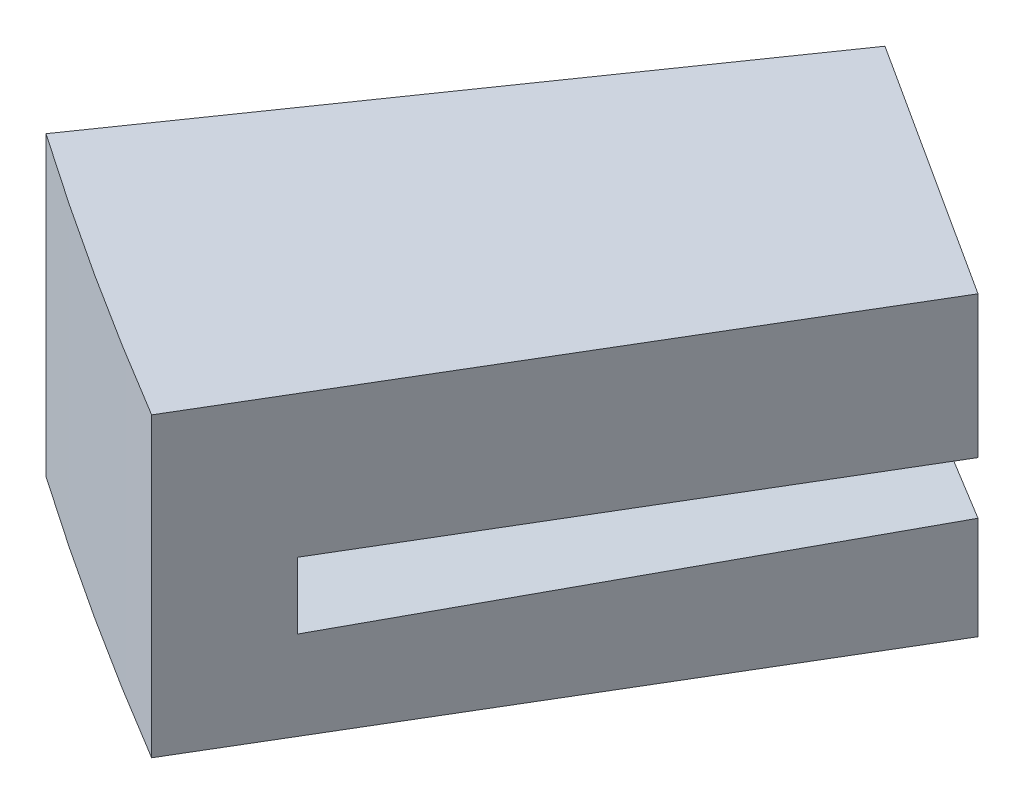
ISO-10303-21;
HEADER;
FILE_DESCRIPTION(('STEP AP214'),'2;1');
FILE_NAME('part.step','',(''),(''),'','','');
FILE_SCHEMA(('AUTOMOTIVE_DESIGN { 1 0 10303 214 1 1 1 1 }'));
ENDSEC;
DATA;
#1=APPLICATION_CONTEXT('core data for automotive mechanical design processes');
#2=APPLICATION_PROTOCOL_DEFINITION('international standard','automotive_design',2000,#1);
#3=PRODUCT_CONTEXT('',#1,'mechanical');
#4=PRODUCT('Part','Part','',(#3));
#5=PRODUCT_RELATED_PRODUCT_CATEGORY('part','',(#4));
#6=PRODUCT_DEFINITION_FORMATION('','',#4);
#7=PRODUCT_DEFINITION_CONTEXT('part definition',#1,'design');
#8=PRODUCT_DEFINITION('design','',#6,#7);
#9=PRODUCT_DEFINITION_SHAPE('','',#8);
#10=(LENGTH_UNIT() NAMED_UNIT(*) SI_UNIT(.MILLI.,.METRE.));
#11=(NAMED_UNIT(*) PLANE_ANGLE_UNIT() SI_UNIT($,.RADIAN.));
#12=(NAMED_UNIT(*) SI_UNIT($,.STERADIAN.) SOLID_ANGLE_UNIT());
#13=UNCERTAINTY_MEASURE_WITH_UNIT(LENGTH_MEASURE(1.E-05),#10,'distance_accuracy_value','');
#14=(GEOMETRIC_REPRESENTATION_CONTEXT(3) GLOBAL_UNCERTAINTY_ASSIGNED_CONTEXT((#13)) GLOBAL_UNIT_ASSIGNED_CONTEXT((#10,
#11,#12)) REPRESENTATION_CONTEXT('',''));
#15=CARTESIAN_POINT('',(0.,0.,0.));
#16=DIRECTION('',(0.,0.,1.));
#17=DIRECTION('',(1.,0.,0.));
#18=AXIS2_PLACEMENT_3D('',#15,#16,#17);
#19=CARTESIAN_POINT('',(0.,0.,0.));
#20=DIRECTION('',(0.,-1.,0.));
#21=DIRECTION('',(0.,0.,-1.));
#22=AXIS2_PLACEMENT_3D('',#19,#20,#21);
#23=PLANE('',#22);
#24=CARTESIAN_POINT('',(0.,0.,0.));
#25=DIRECTION('',(0.,-1.,0.));
#26=DIRECTION('',(0.,0.,-1.));
#27=AXIS2_PLACEMENT_3D('',#24,#25,#26);
#28=CIRCLE('',#27,318.439999898);
#29=CARTESIAN_POINT('',(-162.866634619958,0.,273.639348162152));
#30=VERTEX_POINT('',#29);
#31=CARTESIAN_POINT('',(-181.558015689106,0.,261.611774341433));
#32=VERTEX_POINT('',#31);
#33=EDGE_CURVE('E121',#30,#32,#28,.T.);
#34=ORIENTED_EDGE('',*,*,#33,.F.);
#35=DIRECTION('',(-0.840939238075142,0.,-0.541129557375681));
#36=VECTOR('',#35,1.);
#37=CARTESIAN_POINT('',(-172.212325154532,0.,267.625561251792));
#38=LINE('',#37,#36);
#39=EDGE_CURVE('E120',#30,#32,#38,.T.);
#40=ORIENTED_EDGE('',*,*,#39,.T.);
#41=EDGE_LOOP('',(#34,#40));
#42=FACE_BOUND('',#41,.T.);
#43=ADVANCED_FACE('F41',(#42),#23,.F.);
#44=CARTESIAN_POINT('',(-7.52478073643214E-13,4.7625,-5.22218184728641E-13));
#45=DIRECTION('',(0.821541811409466,0.,0.570148272036365));
#46=DIRECTION('',(0.570148272036365,0.,-0.821541811409467));
#47=AXIS2_PLACEMENT_3D('',#44,#45,#46);
#48=PLANE('',#47);
#49=DIRECTION('',(0.,-1.,0.));
#50=VECTOR('',#49,1.);
#51=CARTESIAN_POINT('',(-201.832488242719,4.7625,290.825801155153));
#52=LINE('',#51,#50);
#53=CARTESIAN_POINT('',(-201.832488242719,4.7625,290.825801155153));
#54=VERTEX_POINT('',#53);
#55=CARTESIAN_POINT('',(-201.832488242718,0.,290.825801155154));
#56=VERTEX_POINT('',#55);
#57=EDGE_CURVE('E128',#54,#56,#52,.T.);
#58=ORIENTED_EDGE('',*,*,#57,.T.);
#59=DIRECTION('',(-0.569922963928908,-0.0281103719182743,0.821217158964122));
#60=VECTOR('',#59,1.);
#61=CARTESIAN_POINT('',(-0.159486621275935,9.94713924557816,0.229808515021203));
#62=LINE('',#61,#60);
#63=CARTESIAN_POINT('',(-181.558015689105,1.,261.611774341433));
#64=VERTEX_POINT('',#63);
#65=EDGE_CURVE('E113',#64,#56,#62,.T.);
#66=ORIENTED_EDGE('',*,*,#65,.F.);
#67=DIRECTION('',(0.,1.,0.));
#68=VECTOR('',#67,1.);
#69=CARTESIAN_POINT('',(-181.558015689105,0.,261.611774341433));
#70=LINE('',#69,#68);
#71=EDGE_CURVE('E125',#32,#64,#70,.T.);
#72=ORIENTED_EDGE('',*,*,#71,.F.);
#73=DIRECTION('',(0.,1.,0.));
#74=VECTOR('',#73,1.);
#75=CARTESIAN_POINT('',(-181.558015689106,-6.35,261.611774341433));
#76=LINE('',#75,#74);
#77=CARTESIAN_POINT('',(-181.558015689106,-6.35,261.611774341433));
#78=VERTEX_POINT('',#77);
#79=EDGE_CURVE('E156',#78,#32,#76,.T.);
#80=ORIENTED_EDGE('',*,*,#79,.F.);
#81=DIRECTION('',(0.570148272036365,0.,-0.821541811409466));
#82=VECTOR('',#81,1.);
#83=CARTESIAN_POINT('',(-7.52478073643214E-13,-6.35,-5.22218184728641E-13));
#84=LINE('',#83,#82);
#85=CARTESIAN_POINT('',(-206.177018075636,-6.35,297.085949758093));
#86=VERTEX_POINT('',#85);
#87=EDGE_CURVE('E143',#86,#78,#84,.T.);
#88=ORIENTED_EDGE('',*,*,#87,.F.);
#89=DIRECTION('',(0.,-1.,0.));
#90=VECTOR('',#89,1.);
#91=CARTESIAN_POINT('',(-206.177018075636,4.7625,297.085949758093));
#92=LINE('',#91,#90);
#93=CARTESIAN_POINT('',(-206.177018075636,14.9225,297.085949758093));
#94=VERTEX_POINT('',#93);
#95=EDGE_CURVE('E11',#94,#86,#92,.T.);
#96=ORIENTED_EDGE('',*,*,#95,.F.);
#97=DIRECTION('',(-0.570148272036365,0.,0.821541811409467));
#98=VECTOR('',#97,1.);
#99=CARTESIAN_POINT('',(-206.177018075636,14.9225,297.085949758093));
#100=LINE('',#99,#98);
#101=CARTESIAN_POINT('',(-181.558015689106,14.9225,261.611774341433));
#102=VERTEX_POINT('',#101);
#103=EDGE_CURVE('E166',#102,#94,#100,.T.);
#104=ORIENTED_EDGE('',*,*,#103,.F.);
#105=DIRECTION('',(0.,-1.,0.));
#106=VECTOR('',#105,1.);
#107=CARTESIAN_POINT('',(-181.558015689106,14.9225,261.611774341433));
#108=LINE('',#107,#106);
#109=CARTESIAN_POINT('',(-181.558015689106,4.7625,261.611774341433));
#110=VERTEX_POINT('',#109);
#111=EDGE_CURVE('E169',#102,#110,#108,.T.);
#112=ORIENTED_EDGE('',*,*,#111,.T.);
#113=DIRECTION('',(-0.570148272036365,0.,0.821541811409467));
#114=VECTOR('',#113,1.);
#115=CARTESIAN_POINT('',(-206.177018075636,4.7625,297.085949758093));
#116=LINE('',#115,#114);
#117=EDGE_CURVE('E162',#110,#54,#116,.T.);
#118=ORIENTED_EDGE('',*,*,#117,.T.);
#119=EDGE_LOOP('',(#58,#66,#72,#80,#88,#96,#104,#112,#118));
#120=FACE_BOUND('',#119,.T.);
#121=ADVANCED_FACE('F43',(#120),#48,.F.);
#122=CARTESIAN_POINT('',(0.,4.7625,0.));
#123=DIRECTION('',(0.,-1.,0.));
#124=DIRECTION('',(0.,0.,-1.));
#125=AXIS2_PLACEMENT_3D('',#122,#123,#124);
#126=CYLINDRICAL_SURFACE('',#125,361.619999898);
#127=ORIENTED_EDGE('',*,*,#95,.T.);
#128=CARTESIAN_POINT('',(0.,-6.35,0.));
#129=DIRECTION('',(0.,-1.,0.));
#130=DIRECTION('',(0.,0.,-1.));
#131=AXIS2_PLACEMENT_3D('',#128,#129,#130);
#132=CIRCLE('',#131,361.619999898);
#133=CARTESIAN_POINT('',(-184.951112967974,-6.35,310.744445064006));
#134=VERTEX_POINT('',#133);
#135=EDGE_CURVE('E140',#134,#86,#132,.T.);
#136=ORIENTED_EDGE('',*,*,#135,.F.);
#137=DIRECTION('',(0.,-1.,0.));
#138=VECTOR('',#137,1.);
#139=CARTESIAN_POINT('',(-184.951112967974,4.7625,310.744445064006));
#140=LINE('',#139,#138);
#141=CARTESIAN_POINT('',(-184.951112967974,14.9225,310.744445064006));
#142=VERTEX_POINT('',#141);
#143=EDGE_CURVE('E49',#142,#134,#140,.T.);
#144=ORIENTED_EDGE('',*,*,#143,.F.);
#145=CARTESIAN_POINT('',(0.,14.9225,0.));
#146=DIRECTION('',(0.,1.,0.));
#147=DIRECTION('',(0.,0.,1.));
#148=AXIS2_PLACEMENT_3D('',#145,#146,#147);
#149=CIRCLE('',#148,361.619999898);
#150=EDGE_CURVE('E158',#94,#142,#149,.T.);
#151=ORIENTED_EDGE('',*,*,#150,.F.);
#152=EDGE_LOOP('',(#127,#136,#144,#151));
#153=FACE_BOUND('',#152,.T.);
#154=ADVANCED_FACE('F196',(#153),#126,.T.);
#155=CARTESIAN_POINT('',(5.48566151552732E-13,4.7625,3.26499546099171E-13));
#156=DIRECTION('',(0.859312109815982,0.,0.511451559703952));
#157=DIRECTION('',(0.511451559703952,0.,-0.859312109815983));
#158=AXIS2_PLACEMENT_3D('',#155,#156,#157);
#159=PLANE('',#158);
#160=ORIENTED_EDGE('',*,*,#143,.T.);
#161=DIRECTION('',(-0.511451559703952,0.,0.859312109815982));
#162=VECTOR('',#161,1.);
#163=CARTESIAN_POINT('',(5.48566151552732E-13,-6.35,3.26499546099171E-13));
#164=LINE('',#163,#162);
#165=CARTESIAN_POINT('',(-162.866634619958,-6.35,273.639348162152));
#166=VERTEX_POINT('',#165);
#167=EDGE_CURVE('E148',#166,#134,#164,.T.);
#168=ORIENTED_EDGE('',*,*,#167,.F.);
#169=DIRECTION('',(0.,1.,0.));
#170=VECTOR('',#169,1.);
#171=CARTESIAN_POINT('',(-162.866634619958,-6.35,273.639348162152));
#172=LINE('',#171,#170);
#173=EDGE_CURVE('E151',#166,#30,#172,.T.);
#174=ORIENTED_EDGE('',*,*,#173,.T.);
#175=DIRECTION('',(0.,1.,0.));
#176=VECTOR('',#175,1.);
#177=CARTESIAN_POINT('',(-162.866634619958,0.,273.639348162152));
#178=LINE('',#177,#176);
#179=CARTESIAN_POINT('',(-162.866634619958,1.,273.639348162152));
#180=VERTEX_POINT('',#179);
#181=EDGE_CURVE('E135',#30,#180,#178,.T.);
#182=ORIENTED_EDGE('',*,*,#181,.T.);
#183=DIRECTION('',(-0.511249447045499,-0.0281103719182743,0.858972531508597));
#184=VECTOR('',#183,1.);
#185=CARTESIAN_POINT('',(-0.143067488238024,9.94713924557816,0.240373937338321));
#186=LINE('',#185,#184);
#187=CARTESIAN_POINT('',(-181.053852083031,0.,304.196486787208));
#188=VERTEX_POINT('',#187);
#189=EDGE_CURVE('E116',#180,#188,#186,.T.);
#190=ORIENTED_EDGE('',*,*,#189,.T.);
#191=DIRECTION('',(0.,-1.,0.));
#192=VECTOR('',#191,1.);
#193=CARTESIAN_POINT('',(-181.05385208303,4.7625,304.196486787208));
#194=LINE('',#193,#192);
#195=CARTESIAN_POINT('',(-181.05385208303,4.7625,304.196486787208));
#196=VERTEX_POINT('',#195);
#197=EDGE_CURVE('E183',#196,#188,#194,.T.);
#198=ORIENTED_EDGE('',*,*,#197,.F.);
#199=DIRECTION('',(0.51145155970395,0.,-0.859312109815984));
#200=VECTOR('',#199,1.);
#201=CARTESIAN_POINT('',(-184.951112967974,4.7625,310.744445064006));
#202=LINE('',#201,#200);
#203=CARTESIAN_POINT('',(-162.866634619958,4.7625,273.639348162152));
#204=VERTEX_POINT('',#203);
#205=EDGE_CURVE('E56',#196,#204,#202,.T.);
#206=ORIENTED_EDGE('',*,*,#205,.T.);
#207=DIRECTION('',(0.,-1.,0.));
#208=VECTOR('',#207,1.);
#209=CARTESIAN_POINT('',(-162.866634619958,14.9225,273.639348162152));
#210=LINE('',#209,#208);
#211=CARTESIAN_POINT('',(-162.866634619958,14.9225,273.639348162152));
#212=VERTEX_POINT('',#211);
#213=EDGE_CURVE('E176',#212,#204,#210,.T.);
#214=ORIENTED_EDGE('',*,*,#213,.F.);
#215=DIRECTION('',(0.51145155970395,0.,-0.859312109815984));
#216=VECTOR('',#215,1.);
#217=CARTESIAN_POINT('',(-184.951112967974,14.9225,310.744445064006));
#218=LINE('',#217,#216);
#219=EDGE_CURVE('E161',#142,#212,#218,.T.);
#220=ORIENTED_EDGE('',*,*,#219,.F.);
#221=EDGE_LOOP('',(#160,#168,#174,#182,#190,#198,#206,#214,#220));
#222=FACE_BOUND('',#221,.T.);
#223=ADVANCED_FACE('F188',(#222),#159,.T.);
#224=CARTESIAN_POINT('',(0.,4.7625,0.));
#225=DIRECTION('',(0.,-1.,0.));
#226=DIRECTION('',(0.,0.,-1.));
#227=AXIS2_PLACEMENT_3D('',#224,#225,#226);
#228=CYLINDRICAL_SURFACE('',#227,353.999999898);
#229=CARTESIAN_POINT('',(0.,0.,0.));
#230=DIRECTION('',(0.,1.,0.));
#231=DIRECTION('',(0.,0.,1.));
#232=AXIS2_PLACEMENT_3D('',#229,#230,#231);
#233=CIRCLE('',#232,353.999999898);
#234=EDGE_CURVE('E179',#56,#188,#233,.T.);
#235=ORIENTED_EDGE('',*,*,#234,.F.);
#236=ORIENTED_EDGE('',*,*,#57,.F.);
#237=CARTESIAN_POINT('',(0.,4.7625,0.));
#238=DIRECTION('',(0.,1.,0.));
#239=DIRECTION('',(0.,0.,1.));
#240=AXIS2_PLACEMENT_3D('',#237,#238,#239);
#241=CIRCLE('',#240,353.999999898);
#242=EDGE_CURVE('E61',#54,#196,#241,.T.);
#243=ORIENTED_EDGE('',*,*,#242,.T.);
#244=ORIENTED_EDGE('',*,*,#197,.T.);
#245=EDGE_LOOP('',(#235,#236,#243,#244));
#246=FACE_BOUND('',#245,.T.);
#247=ADVANCED_FACE('F221',(#246),#228,.F.);
#248=CARTESIAN_POINT('',(0.,4.7625,0.));
#249=DIRECTION('',(0.,1.,0.));
#250=DIRECTION('',(0.,0.,1.));
#251=AXIS2_PLACEMENT_3D('',#248,#249,#250);
#252=PLANE('',#251);
#253=ORIENTED_EDGE('',*,*,#242,.F.);
#254=ORIENTED_EDGE('',*,*,#117,.F.);
#255=DIRECTION('',(-0.84093923807514,0.,-0.541129557375683));
#256=VECTOR('',#255,1.);
#257=CARTESIAN_POINT('',(-181.558015689106,4.7625,261.611774341433));
#258=LINE('',#257,#256);
#259=EDGE_CURVE('E171',#204,#110,#258,.T.);
#260=ORIENTED_EDGE('',*,*,#259,.F.);
#261=ORIENTED_EDGE('',*,*,#205,.F.);
#262=EDGE_LOOP('',(#253,#254,#260,#261));
#263=FACE_BOUND('',#262,.T.);
#264=ADVANCED_FACE('F218',(#263),#252,.F.);
#265=CARTESIAN_POINT('',(-181.558015689106,14.9225,261.611774341433));
#266=DIRECTION('',(-0.541129557375683,0.,0.840939238075141));
#267=DIRECTION('',(0.840939238075141,0.,0.541129557375683));
#268=AXIS2_PLACEMENT_3D('',#265,#266,#267);
#269=PLANE('',#268);
#270=ORIENTED_EDGE('',*,*,#259,.T.);
#271=ORIENTED_EDGE('',*,*,#111,.F.);
#272=DIRECTION('',(-0.84093923807514,0.,-0.541129557375683));
#273=VECTOR('',#272,1.);
#274=CARTESIAN_POINT('',(-181.558015689106,14.9225,261.611774341433));
#275=LINE('',#274,#273);
#276=EDGE_CURVE('E164',#212,#102,#275,.T.);
#277=ORIENTED_EDGE('',*,*,#276,.F.);
#278=ORIENTED_EDGE('',*,*,#213,.T.);
#279=EDGE_LOOP('',(#270,#271,#277,#278));
#280=FACE_BOUND('',#279,.T.);
#281=ADVANCED_FACE('F216',(#280),#269,.F.);
#282=CARTESIAN_POINT('',(0.,14.9225,0.));
#283=DIRECTION('',(0.,1.,0.));
#284=DIRECTION('',(0.,0.,1.));
#285=AXIS2_PLACEMENT_3D('',#282,#283,#284);
#286=PLANE('',#285);
#287=ORIENTED_EDGE('',*,*,#150,.T.);
#288=ORIENTED_EDGE('',*,*,#219,.T.);
#289=ORIENTED_EDGE('',*,*,#276,.T.);
#290=ORIENTED_EDGE('',*,*,#103,.T.);
#291=EDGE_LOOP('',(#287,#288,#289,#290));
#292=FACE_BOUND('',#291,.T.);
#293=ADVANCED_FACE('F213',(#292),#286,.T.);
#294=CARTESIAN_POINT('',(-172.212325154532,-6.35,267.625561251792));
#295=DIRECTION('',(0.541129557375681,0.,-0.840939238075142));
#296=DIRECTION('',(-0.840939238075142,0.,-0.541129557375681));
#297=AXIS2_PLACEMENT_3D('',#294,#295,#296);
#298=PLANE('',#297);
#299=ORIENTED_EDGE('',*,*,#39,.F.);
#300=ORIENTED_EDGE('',*,*,#173,.F.);
#301=DIRECTION('',(-0.840939238075142,0.,-0.541129557375681));
#302=VECTOR('',#301,1.);
#303=CARTESIAN_POINT('',(-172.212325154532,-6.35,267.625561251792));
#304=LINE('',#303,#302);
#305=EDGE_CURVE('E145',#166,#78,#304,.T.);
#306=ORIENTED_EDGE('',*,*,#305,.T.);
#307=ORIENTED_EDGE('',*,*,#79,.T.);
#308=EDGE_LOOP('',(#299,#300,#306,#307));
#309=FACE_BOUND('',#308,.T.);
#310=ADVANCED_FACE('F201',(#309),#298,.T.);
#311=CARTESIAN_POINT('',(0.,-6.35,0.));
#312=DIRECTION('',(0.,-1.,0.));
#313=DIRECTION('',(0.,0.,-1.));
#314=AXIS2_PLACEMENT_3D('',#311,#312,#313);
#315=PLANE('',#314);
#316=ORIENTED_EDGE('',*,*,#135,.T.);
#317=ORIENTED_EDGE('',*,*,#87,.T.);
#318=ORIENTED_EDGE('',*,*,#305,.F.);
#319=ORIENTED_EDGE('',*,*,#167,.T.);
#320=EDGE_LOOP('',(#316,#317,#318,#319));
#321=FACE_BOUND('',#320,.T.);
#322=ADVANCED_FACE('F195',(#321),#315,.T.);
#323=CARTESIAN_POINT('',(0.,1.,0.));
#324=DIRECTION('',(0.,-1.,0.));
#325=DIRECTION('',(0.,0.,-1.));
#326=AXIS2_PLACEMENT_3D('',#323,#324,#325);
#327=CONICAL_SURFACE('',#326,318.439999898,1.54268225145635);
#328=CARTESIAN_POINT('',(0.,1.,0.));
#329=DIRECTION('',(0.,-1.,0.));
#330=DIRECTION('',(0.,0.,-1.));
#331=AXIS2_PLACEMENT_3D('',#328,#329,#330);
#332=CIRCLE('',#331,318.439999898);
#333=EDGE_CURVE('E110',#180,#64,#332,.T.);
#334=ORIENTED_EDGE('',*,*,#333,.T.);
#335=ORIENTED_EDGE('',*,*,#65,.T.);
#336=ORIENTED_EDGE('',*,*,#234,.T.);
#337=ORIENTED_EDGE('',*,*,#189,.F.);
#338=EDGE_LOOP('',(#334,#335,#336,#337));
#339=FACE_BOUND('',#338,.T.);
#340=ADVANCED_FACE('F112',(#339),#327,.T.);
#341=CARTESIAN_POINT('',(0.,0.,0.));
#342=DIRECTION('',(0.,-1.,0.));
#343=DIRECTION('',(0.,0.,-1.));
#344=AXIS2_PLACEMENT_3D('',#341,#342,#343);
#345=CYLINDRICAL_SURFACE('',#344,318.439999898);
#346=ORIENTED_EDGE('',*,*,#33,.T.);
#347=ORIENTED_EDGE('',*,*,#71,.T.);
#348=ORIENTED_EDGE('',*,*,#333,.F.);
#349=ORIENTED_EDGE('',*,*,#181,.F.);
#350=EDGE_LOOP('',(#346,#347,#348,#349));
#351=FACE_BOUND('',#350,.T.);
#352=ADVANCED_FACE('F131',(#351),#345,.F.);
#353=CLOSED_SHELL('',(#43,#121,#154,#223,#247,#264,#281,#293,#310,#322,#340,#352));
#354=MANIFOLD_SOLID_BREP('B2',#353);
#355=ADVANCED_BREP_SHAPE_REPRESENTATION('',(#18,#354),#14);
#356=SHAPE_DEFINITION_REPRESENTATION(#9,#355);
ENDSEC;
END-ISO-10303-21;
